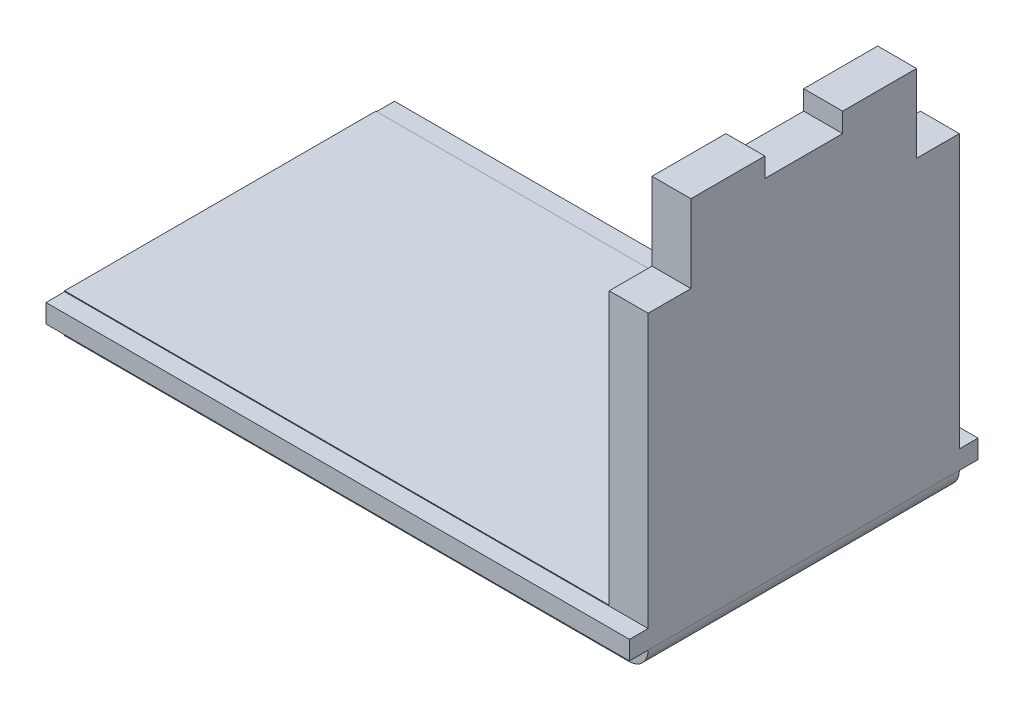
ISO-10303-21;
HEADER;
FILE_DESCRIPTION(('STEP AP214'),'2;1');
FILE_NAME('part.step','',(''),(''),'','','');
FILE_SCHEMA(('AUTOMOTIVE_DESIGN { 1 0 10303 214 1 1 1 1 }'));
ENDSEC;
DATA;
#1=APPLICATION_CONTEXT('core data for automotive mechanical design processes');
#2=APPLICATION_PROTOCOL_DEFINITION('international standard','automotive_design',2000,#1);
#3=PRODUCT_CONTEXT('',#1,'mechanical');
#4=PRODUCT('Part','Part','',(#3));
#5=PRODUCT_RELATED_PRODUCT_CATEGORY('part','',(#4));
#6=PRODUCT_DEFINITION_FORMATION('','',#4);
#7=PRODUCT_DEFINITION_CONTEXT('part definition',#1,'design');
#8=PRODUCT_DEFINITION('design','',#6,#7);
#9=PRODUCT_DEFINITION_SHAPE('','',#8);
#10=(LENGTH_UNIT() NAMED_UNIT(*) SI_UNIT(.MILLI.,.METRE.));
#11=(NAMED_UNIT(*) PLANE_ANGLE_UNIT() SI_UNIT($,.RADIAN.));
#12=(NAMED_UNIT(*) SI_UNIT($,.STERADIAN.) SOLID_ANGLE_UNIT());
#13=UNCERTAINTY_MEASURE_WITH_UNIT(LENGTH_MEASURE(1.E-05),#10,'distance_accuracy_value','');
#14=(GEOMETRIC_REPRESENTATION_CONTEXT(3) GLOBAL_UNCERTAINTY_ASSIGNED_CONTEXT((#13)) GLOBAL_UNIT_ASSIGNED_CONTEXT((#10,
#11,#12)) REPRESENTATION_CONTEXT('',''));
#15=CARTESIAN_POINT('',(0.,0.,0.));
#16=DIRECTION('',(0.,0.,1.));
#17=DIRECTION('',(1.,0.,0.));
#18=AXIS2_PLACEMENT_3D('',#15,#16,#17);
#19=CARTESIAN_POINT('',(70.,100.,80.));
#20=DIRECTION('',(0.,-1.,0.));
#21=DIRECTION('',(0.,0.,-1.));
#22=AXIS2_PLACEMENT_3D('',#19,#20,#21);
#23=PLANE('',#22);
#24=DIRECTION('',(0.,0.,-1.));
#25=VECTOR('',#24,1.);
#26=CARTESIAN_POINT('',(70.,100.,80.));
#27=LINE('',#26,#25);
#28=CARTESIAN_POINT('',(70.,100.,30.));
#29=VERTEX_POINT('',#28);
#30=CARTESIAN_POINT('',(70.,100.,11.));
#31=VERTEX_POINT('',#30);
#32=EDGE_CURVE('E226',#29,#31,#27,.T.);
#33=ORIENTED_EDGE('',*,*,#32,.T.);
#34=DIRECTION('',(1.,0.,0.));
#35=VECTOR('',#34,1.);
#36=CARTESIAN_POINT('',(-80.,100.,11.));
#37=LINE('',#36,#35);
#38=CARTESIAN_POINT('',(60.,100.,11.));
#39=VERTEX_POINT('',#38);
#40=EDGE_CURVE('E400',#39,#31,#37,.T.);
#41=ORIENTED_EDGE('',*,*,#40,.F.);
#42=DIRECTION('',(0.,0.,-1.));
#43=VECTOR('',#42,1.);
#44=CARTESIAN_POINT('',(60.,100.,80.));
#45=LINE('',#44,#43);
#46=CARTESIAN_POINT('',(60.,100.,30.));
#47=VERTEX_POINT('',#46);
#48=EDGE_CURVE('E235',#47,#39,#45,.T.);
#49=ORIENTED_EDGE('',*,*,#48,.F.);
#50=DIRECTION('',(1.,0.,0.));
#51=VECTOR('',#50,1.);
#52=CARTESIAN_POINT('',(-80.,100.,30.));
#53=LINE('',#52,#51);
#54=EDGE_CURVE('E422',#47,#29,#53,.T.);
#55=ORIENTED_EDGE('',*,*,#54,.T.);
#56=EDGE_LOOP('',(#33,#41,#49,#55));
#57=FACE_BOUND('',#56,.T.);
#58=ADVANCED_FACE('F44',(#57),#23,.F.);
#59=CARTESIAN_POINT('',(0.,0.,0.));
#60=DIRECTION('',(0.,0.,-1.));
#61=DIRECTION('',(-1.,0.,0.));
#62=AXIS2_PLACEMENT_3D('',#59,#60,#61);
#63=PLANE('',#62);
#64=DIRECTION('',(1.,0.,0.));
#65=VECTOR('',#64,1.);
#66=CARTESIAN_POINT('',(-86.7882250993909,5.,0.));
#67=LINE('',#66,#65);
#68=CARTESIAN_POINT('',(-80.,5.,0.));
#69=VERTEX_POINT('',#68);
#70=CARTESIAN_POINT('',(70.,5.,0.));
#71=VERTEX_POINT('',#70);
#72=EDGE_CURVE('E280',#69,#71,#67,.T.);
#73=ORIENTED_EDGE('',*,*,#72,.T.);
#74=CARTESIAN_POINT('',(65.,5.,0.));
#75=DIRECTION('',(0.,0.,-1.));
#76=DIRECTION('',(-1.,0.,0.));
#77=AXIS2_PLACEMENT_3D('',#74,#75,#76);
#78=CIRCLE('',#77,5.);
#79=CARTESIAN_POINT('',(65.,0.,0.));
#80=VERTEX_POINT('',#79);
#81=EDGE_CURVE('E67',#71,#80,#78,.T.);
#82=ORIENTED_EDGE('',*,*,#81,.T.);
#83=DIRECTION('',(1.,0.,0.));
#84=VECTOR('',#83,1.);
#85=CARTESIAN_POINT('',(-80.,0.,0.));
#86=LINE('',#85,#84);
#87=CARTESIAN_POINT('',(-80.,0.,0.));
#88=VERTEX_POINT('',#87);
#89=EDGE_CURVE('E362',#88,#80,#86,.T.);
#90=ORIENTED_EDGE('',*,*,#89,.F.);
#91=DIRECTION('',(0.,-1.,0.));
#92=VECTOR('',#91,1.);
#93=CARTESIAN_POINT('',(-80.,0.,0.));
#94=LINE('',#93,#92);
#95=EDGE_CURVE('E282',#69,#88,#94,.T.);
#96=ORIENTED_EDGE('',*,*,#95,.F.);
#97=EDGE_LOOP('',(#73,#82,#90,#96));
#98=FACE_BOUND('',#97,.T.);
#99=ADVANCED_FACE('F281',(#98),#63,.T.);
#100=CARTESIAN_POINT('',(0.,0.,80.));
#101=DIRECTION('',(0.,0.,-1.));
#102=DIRECTION('',(-1.,0.,0.));
#103=AXIS2_PLACEMENT_3D('',#100,#101,#102);
#104=PLANE('',#103);
#105=DIRECTION('',(1.,0.,0.));
#106=VECTOR('',#105,1.);
#107=CARTESIAN_POINT('',(-80.,0.,80.));
#108=LINE('',#107,#106);
#109=CARTESIAN_POINT('',(-80.,0.,80.));
#110=VERTEX_POINT('',#109);
#111=CARTESIAN_POINT('',(65.,0.,80.));
#112=VERTEX_POINT('',#111);
#113=EDGE_CURVE('E343',#110,#112,#108,.T.);
#114=ORIENTED_EDGE('',*,*,#113,.T.);
#115=CARTESIAN_POINT('',(65.,5.,80.));
#116=DIRECTION('',(0.,0.,-1.));
#117=DIRECTION('',(-1.,0.,0.));
#118=AXIS2_PLACEMENT_3D('',#115,#116,#117);
#119=CIRCLE('',#118,5.);
#120=CARTESIAN_POINT('',(70.,5.,80.));
#121=VERTEX_POINT('',#120);
#122=EDGE_CURVE('E11',#112,#121,#119,.F.);
#123=ORIENTED_EDGE('',*,*,#122,.T.);
#124=DIRECTION('',(1.,0.,0.));
#125=VECTOR('',#124,1.);
#126=CARTESIAN_POINT('',(-86.7882250993909,5.,80.));
#127=LINE('',#126,#125);
#128=CARTESIAN_POINT('',(-80.,5.,80.));
#129=VERTEX_POINT('',#128);
#130=EDGE_CURVE('E328',#129,#121,#127,.T.);
#131=ORIENTED_EDGE('',*,*,#130,.F.);
#132=DIRECTION('',(0.,-1.,0.));
#133=VECTOR('',#132,1.);
#134=CARTESIAN_POINT('',(-80.,0.,80.));
#135=LINE('',#134,#133);
#136=EDGE_CURVE('E344',#129,#110,#135,.T.);
#137=ORIENTED_EDGE('',*,*,#136,.T.);
#138=EDGE_LOOP('',(#114,#123,#131,#137));
#139=FACE_BOUND('',#138,.T.);
#140=ADVANCED_FACE('F501',(#139),#104,.F.);
#141=CARTESIAN_POINT('',(-80.,0.,80.));
#142=DIRECTION('',(1.,0.,0.));
#143=DIRECTION('',(0.,0.,-1.));
#144=AXIS2_PLACEMENT_3D('',#141,#142,#143);
#145=PLANE('',#144);
#146=CARTESIAN_POINT('',(-80.,10.,0.));
#147=VERTEX_POINT('',#146);
#148=CARTESIAN_POINT('',(-80.,9.8,0.));
#149=VERTEX_POINT('',#148);
#150=EDGE_CURVE('E358',#147,#149,#94,.T.);
#151=ORIENTED_EDGE('',*,*,#150,.T.);
#152=DIRECTION('',(0.,0.,-1.));
#153=VECTOR('',#152,1.);
#154=CARTESIAN_POINT('',(-80.,9.8,-4.8));
#155=LINE('',#154,#153);
#156=CARTESIAN_POINT('',(-80.,9.8,-4.8));
#157=VERTEX_POINT('',#156);
#158=EDGE_CURVE('E288',#149,#157,#155,.T.);
#159=ORIENTED_EDGE('',*,*,#158,.T.);
#160=DIRECTION('',(0.,-1.,0.));
#161=VECTOR('',#160,1.);
#162=CARTESIAN_POINT('',(-80.,5.,-4.8));
#163=LINE('',#162,#161);
#164=CARTESIAN_POINT('',(-80.,5.,-4.8));
#165=VERTEX_POINT('',#164);
#166=EDGE_CURVE('E308',#157,#165,#163,.T.);
#167=ORIENTED_EDGE('',*,*,#166,.T.);
#168=DIRECTION('',(0.,0.,1.));
#169=VECTOR('',#168,1.);
#170=CARTESIAN_POINT('',(-80.,5.,0.));
#171=LINE('',#170,#169);
#172=EDGE_CURVE('E305',#165,#69,#171,.T.);
#173=ORIENTED_EDGE('',*,*,#172,.T.);
#174=ORIENTED_EDGE('',*,*,#95,.T.);
#175=DIRECTION('',(0.,0.,-1.));
#176=VECTOR('',#175,1.);
#177=CARTESIAN_POINT('',(-80.,0.,80.));
#178=LINE('',#177,#176);
#179=EDGE_CURVE('E225',#110,#88,#178,.T.);
#180=ORIENTED_EDGE('',*,*,#179,.F.);
#181=ORIENTED_EDGE('',*,*,#136,.F.);
#182=DIRECTION('',(0.,0.,1.));
#183=VECTOR('',#182,1.);
#184=CARTESIAN_POINT('',(-80.,5.,80.));
#185=LINE('',#184,#183);
#186=CARTESIAN_POINT('',(-80.,5.,84.8));
#187=VERTEX_POINT('',#186);
#188=EDGE_CURVE('E319',#129,#187,#185,.T.);
#189=ORIENTED_EDGE('',*,*,#188,.T.);
#190=DIRECTION('',(0.,1.,0.));
#191=VECTOR('',#190,1.);
#192=CARTESIAN_POINT('',(-80.,5.,84.8));
#193=LINE('',#192,#191);
#194=CARTESIAN_POINT('',(-80.,9.8,84.8));
#195=VERTEX_POINT('',#194);
#196=EDGE_CURVE('E315',#187,#195,#193,.T.);
#197=ORIENTED_EDGE('',*,*,#196,.T.);
#198=DIRECTION('',(0.,0.,-1.));
#199=VECTOR('',#198,1.);
#200=CARTESIAN_POINT('',(-80.,9.8,84.8));
#201=LINE('',#200,#199);
#202=CARTESIAN_POINT('',(-80.,9.8,80.));
#203=VERTEX_POINT('',#202);
#204=EDGE_CURVE('E311',#195,#203,#201,.T.);
#205=ORIENTED_EDGE('',*,*,#204,.T.);
#206=CARTESIAN_POINT('',(-80.,10.,80.));
#207=VERTEX_POINT('',#206);
#208=EDGE_CURVE('E340',#207,#203,#135,.T.);
#209=ORIENTED_EDGE('',*,*,#208,.F.);
#210=DIRECTION('',(0.,0.,-1.));
#211=VECTOR('',#210,1.);
#212=CARTESIAN_POINT('',(-80.,10.,80.));
#213=LINE('',#212,#211);
#214=EDGE_CURVE('E357',#207,#147,#213,.T.);
#215=ORIENTED_EDGE('',*,*,#214,.T.);
#216=EDGE_LOOP('',(#151,#159,#167,#173,#174,#180,#181,#189,#197,#205,#209,#215));
#217=FACE_BOUND('',#216,.T.);
#218=ADVANCED_FACE('F463',(#217),#145,.F.);
#219=CARTESIAN_POINT('',(-80.,0.,80.));
#220=DIRECTION('',(0.,1.,0.));
#221=DIRECTION('',(0.,0.,1.));
#222=AXIS2_PLACEMENT_3D('',#219,#220,#221);
#223=PLANE('',#222);
#224=ORIENTED_EDGE('',*,*,#89,.T.);
#225=DIRECTION('',(0.,0.,-1.));
#226=VECTOR('',#225,1.);
#227=CARTESIAN_POINT('',(65.,0.,80.));
#228=LINE('',#227,#226);
#229=EDGE_CURVE('E53',#80,#112,#228,.F.);
#230=ORIENTED_EDGE('',*,*,#229,.T.);
#231=ORIENTED_EDGE('',*,*,#113,.F.);
#232=ORIENTED_EDGE('',*,*,#179,.T.);
#233=EDGE_LOOP('',(#224,#230,#231,#232));
#234=FACE_BOUND('',#233,.T.);
#235=ADVANCED_FACE('F509',(#234),#223,.F.);
#236=CARTESIAN_POINT('',(70.,0.,80.));
#237=DIRECTION('',(-1.,0.,0.));
#238=DIRECTION('',(0.,0.,1.));
#239=AXIS2_PLACEMENT_3D('',#236,#237,#238);
#240=PLANE('',#239);
#241=DIRECTION('',(0.,0.,-1.));
#242=VECTOR('',#241,1.);
#243=CARTESIAN_POINT('',(70.,5.,80.));
#244=LINE('',#243,#242);
#245=CARTESIAN_POINT('',(70.,5.,84.8));
#246=VERTEX_POINT('',#245);
#247=EDGE_CURVE('E276',#246,#121,#244,.T.);
#248=ORIENTED_EDGE('',*,*,#247,.T.);
#249=DIRECTION('',(0.,0.,-1.));
#250=VECTOR('',#249,1.);
#251=CARTESIAN_POINT('',(70.,5.,80.));
#252=LINE('',#251,#250);
#253=EDGE_CURVE('E263',#121,#71,#252,.T.);
#254=ORIENTED_EDGE('',*,*,#253,.T.);
#255=DIRECTION('',(0.,0.,-1.));
#256=VECTOR('',#255,1.);
#257=CARTESIAN_POINT('',(70.,5.,0.));
#258=LINE('',#257,#256);
#259=CARTESIAN_POINT('',(70.,5.,-4.8));
#260=VERTEX_POINT('',#259);
#261=EDGE_CURVE('E273',#71,#260,#258,.T.);
#262=ORIENTED_EDGE('',*,*,#261,.T.);
#263=DIRECTION('',(0.,1.,0.));
#264=VECTOR('',#263,1.);
#265=CARTESIAN_POINT('',(70.,5.,-4.8));
#266=LINE('',#265,#264);
#267=CARTESIAN_POINT('',(70.,9.8,-4.8));
#268=VERTEX_POINT('',#267);
#269=EDGE_CURVE('E295',#260,#268,#266,.T.);
#270=ORIENTED_EDGE('',*,*,#269,.T.);
#271=DIRECTION('',(0.,0.,1.));
#272=VECTOR('',#271,1.);
#273=CARTESIAN_POINT('',(70.,9.8,-4.8));
#274=LINE('',#273,#272);
#275=CARTESIAN_POINT('',(70.,9.8,0.));
#276=VERTEX_POINT('',#275);
#277=EDGE_CURVE('E301',#268,#276,#274,.T.);
#278=ORIENTED_EDGE('',*,*,#277,.T.);
#279=DIRECTION('',(0.,1.,0.));
#280=VECTOR('',#279,1.);
#281=CARTESIAN_POINT('',(70.,0.,0.));
#282=LINE('',#281,#280);
#283=CARTESIAN_POINT('',(70.,80.,0.));
#284=VERTEX_POINT('',#283);
#285=EDGE_CURVE('E365',#276,#284,#282,.T.);
#286=ORIENTED_EDGE('',*,*,#285,.T.);
#287=DIRECTION('',(0.,0.,-1.));
#288=VECTOR('',#287,1.);
#289=CARTESIAN_POINT('',(70.,80.,0.));
#290=LINE('',#289,#288);
#291=CARTESIAN_POINT('',(70.,80.,11.));
#292=VERTEX_POINT('',#291);
#293=EDGE_CURVE('E403',#292,#284,#290,.T.);
#294=ORIENTED_EDGE('',*,*,#293,.F.);
#295=DIRECTION('',(0.,-1.,0.));
#296=VECTOR('',#295,1.);
#297=CARTESIAN_POINT('',(70.,80.,11.));
#298=LINE('',#297,#296);
#299=EDGE_CURVE('E216',#31,#292,#298,.T.);
#300=ORIENTED_EDGE('',*,*,#299,.F.);
#301=ORIENTED_EDGE('',*,*,#32,.F.);
#302=DIRECTION('',(0.,1.,0.));
#303=VECTOR('',#302,1.);
#304=CARTESIAN_POINT('',(70.,95.,30.));
#305=LINE('',#304,#303);
#306=CARTESIAN_POINT('',(70.,95.,30.));
#307=VERTEX_POINT('',#306);
#308=EDGE_CURVE('E418',#307,#29,#305,.T.);
#309=ORIENTED_EDGE('',*,*,#308,.F.);
#310=DIRECTION('',(0.,0.,-1.));
#311=VECTOR('',#310,1.);
#312=CARTESIAN_POINT('',(70.,95.,50.));
#313=LINE('',#312,#311);
#314=CARTESIAN_POINT('',(70.,95.,50.));
#315=VERTEX_POINT('',#314);
#316=EDGE_CURVE('E414',#315,#307,#313,.T.);
#317=ORIENTED_EDGE('',*,*,#316,.F.);
#318=DIRECTION('',(0.,-1.,0.));
#319=VECTOR('',#318,1.);
#320=CARTESIAN_POINT('',(70.,100.,50.));
#321=LINE('',#320,#319);
#322=CARTESIAN_POINT('',(70.,100.,50.));
#323=VERTEX_POINT('',#322);
#324=EDGE_CURVE('E223',#323,#315,#321,.T.);
#325=ORIENTED_EDGE('',*,*,#324,.F.);
#326=CARTESIAN_POINT('',(70.,100.,69.));
#327=VERTEX_POINT('',#326);
#328=EDGE_CURVE('E212',#327,#323,#27,.T.);
#329=ORIENTED_EDGE('',*,*,#328,.F.);
#330=DIRECTION('',(0.,1.,0.));
#331=VECTOR('',#330,1.);
#332=CARTESIAN_POINT('',(70.,80.,69.));
#333=LINE('',#332,#331);
#334=CARTESIAN_POINT('',(70.,80.,69.));
#335=VERTEX_POINT('',#334);
#336=EDGE_CURVE('E193',#335,#327,#333,.T.);
#337=ORIENTED_EDGE('',*,*,#336,.F.);
#338=DIRECTION('',(0.,0.,-1.));
#339=VECTOR('',#338,1.);
#340=CARTESIAN_POINT('',(70.,80.,80.));
#341=LINE('',#340,#339);
#342=CARTESIAN_POINT('',(70.,80.,80.));
#343=VERTEX_POINT('',#342);
#344=EDGE_CURVE('E205',#343,#335,#341,.T.);
#345=ORIENTED_EDGE('',*,*,#344,.F.);
#346=DIRECTION('',(0.,1.,0.));
#347=VECTOR('',#346,1.);
#348=CARTESIAN_POINT('',(70.,0.,80.));
#349=LINE('',#348,#347);
#350=CARTESIAN_POINT('',(70.,9.8,80.));
#351=VERTEX_POINT('',#350);
#352=EDGE_CURVE('E347',#351,#343,#349,.T.);
#353=ORIENTED_EDGE('',*,*,#352,.F.);
#354=DIRECTION('',(0.,0.,1.));
#355=VECTOR('',#354,1.);
#356=CARTESIAN_POINT('',(70.,9.8,84.8));
#357=LINE('',#356,#355);
#358=CARTESIAN_POINT('',(70.,9.8,84.8));
#359=VERTEX_POINT('',#358);
#360=EDGE_CURVE('E299',#351,#359,#357,.T.);
#361=ORIENTED_EDGE('',*,*,#360,.T.);
#362=DIRECTION('',(0.,-1.,0.));
#363=VECTOR('',#362,1.);
#364=CARTESIAN_POINT('',(70.,5.,84.8));
#365=LINE('',#364,#363);
#366=EDGE_CURVE('E325',#359,#246,#365,.T.);
#367=ORIENTED_EDGE('',*,*,#366,.T.);
#368=EDGE_LOOP('',(#248,#254,#262,#270,#278,#286,#294,#300,#301,#309,#317,#325,#329,#337,#345,
#353,#361,#367));
#369=FACE_BOUND('',#368,.T.);
#370=ADVANCED_FACE('F220',(#369),#240,.F.);
#371=CARTESIAN_POINT('',(60.,100.,69.));
#372=VERTEX_POINT('',#371);
#373=CARTESIAN_POINT('',(60.,100.,50.));
#374=VERTEX_POINT('',#373);
#375=EDGE_CURVE('E214',#372,#374,#45,.T.);
#376=ORIENTED_EDGE('',*,*,#375,.F.);
#377=DIRECTION('',(1.,0.,0.));
#378=VECTOR('',#377,1.);
#379=CARTESIAN_POINT('',(-80.,100.,69.));
#380=LINE('',#379,#378);
#381=EDGE_CURVE('E196',#372,#327,#380,.T.);
#382=ORIENTED_EDGE('',*,*,#381,.T.);
#383=ORIENTED_EDGE('',*,*,#328,.T.);
#384=DIRECTION('',(1.,0.,0.));
#385=VECTOR('',#384,1.);
#386=CARTESIAN_POINT('',(-80.,100.,50.));
#387=LINE('',#386,#385);
#388=EDGE_CURVE('E421',#374,#323,#387,.T.);
#389=ORIENTED_EDGE('',*,*,#388,.F.);
#390=EDGE_LOOP('',(#376,#382,#383,#389));
#391=FACE_BOUND('',#390,.T.);
#392=ADVANCED_FACE('F210',(#391),#23,.F.);
#393=CARTESIAN_POINT('',(60.,10.,80.));
#394=DIRECTION('',(1.,0.,0.));
#395=DIRECTION('',(0.,0.,-1.));
#396=AXIS2_PLACEMENT_3D('',#393,#394,#395);
#397=PLANE('',#396);
#398=DIRECTION('',(0.,-1.,0.));
#399=VECTOR('',#398,1.);
#400=CARTESIAN_POINT('',(60.,10.,11.));
#401=LINE('',#400,#399);
#402=CARTESIAN_POINT('',(60.,80.,11.));
#403=VERTEX_POINT('',#402);
#404=EDGE_CURVE('E259',#39,#403,#401,.T.);
#405=ORIENTED_EDGE('',*,*,#404,.T.);
#406=DIRECTION('',(0.,0.,-1.));
#407=VECTOR('',#406,1.);
#408=CARTESIAN_POINT('',(60.,80.0000000000001,79.9999999999999));
#409=LINE('',#408,#407);
#410=CARTESIAN_POINT('',(60.,80.,0.));
#411=VERTEX_POINT('',#410);
#412=EDGE_CURVE('E426',#403,#411,#409,.T.);
#413=ORIENTED_EDGE('',*,*,#412,.T.);
#414=DIRECTION('',(0.,-1.,0.));
#415=VECTOR('',#414,1.);
#416=CARTESIAN_POINT('',(60.,10.,0.));
#417=LINE('',#416,#415);
#418=CARTESIAN_POINT('',(60.,10.,0.));
#419=VERTEX_POINT('',#418);
#420=EDGE_CURVE('E369',#411,#419,#417,.T.);
#421=ORIENTED_EDGE('',*,*,#420,.T.);
#422=DIRECTION('',(0.,0.,-1.));
#423=VECTOR('',#422,1.);
#424=CARTESIAN_POINT('',(60.,10.,80.));
#425=LINE('',#424,#423);
#426=CARTESIAN_POINT('',(60.,10.,80.));
#427=VERTEX_POINT('',#426);
#428=EDGE_CURVE('E377',#427,#419,#425,.T.);
#429=ORIENTED_EDGE('',*,*,#428,.F.);
#430=DIRECTION('',(0.,-1.,0.));
#431=VECTOR('',#430,1.);
#432=CARTESIAN_POINT('',(60.,10.,80.));
#433=LINE('',#432,#431);
#434=CARTESIAN_POINT('',(60.,80.,80.));
#435=VERTEX_POINT('',#434);
#436=EDGE_CURVE('E351',#435,#427,#433,.T.);
#437=ORIENTED_EDGE('',*,*,#436,.F.);
#438=DIRECTION('',(0.,0.,-1.));
#439=VECTOR('',#438,1.);
#440=CARTESIAN_POINT('',(60.,80.,80.));
#441=LINE('',#440,#439);
#442=CARTESIAN_POINT('',(60.,80.,69.));
#443=VERTEX_POINT('',#442);
#444=EDGE_CURVE('E392',#435,#443,#441,.T.);
#445=ORIENTED_EDGE('',*,*,#444,.T.);
#446=DIRECTION('',(0.,1.,0.));
#447=VECTOR('',#446,1.);
#448=CARTESIAN_POINT('',(60.,10.,69.));
#449=LINE('',#448,#447);
#450=EDGE_CURVE('E256',#443,#372,#449,.T.);
#451=ORIENTED_EDGE('',*,*,#450,.T.);
#452=ORIENTED_EDGE('',*,*,#375,.T.);
#453=DIRECTION('',(0.,-1.,0.));
#454=VECTOR('',#453,1.);
#455=CARTESIAN_POINT('',(60.,10.,49.9999999999999));
#456=LINE('',#455,#454);
#457=CARTESIAN_POINT('',(60.,95.,50.));
#458=VERTEX_POINT('',#457);
#459=EDGE_CURVE('E244',#374,#458,#456,.T.);
#460=ORIENTED_EDGE('',*,*,#459,.T.);
#461=DIRECTION('',(0.,0.,-1.));
#462=VECTOR('',#461,1.);
#463=CARTESIAN_POINT('',(60.,95.,80.));
#464=LINE('',#463,#462);
#465=CARTESIAN_POINT('',(60.,95.,30.));
#466=VERTEX_POINT('',#465);
#467=EDGE_CURVE('E248',#458,#466,#464,.T.);
#468=ORIENTED_EDGE('',*,*,#467,.T.);
#469=DIRECTION('',(0.,1.,0.));
#470=VECTOR('',#469,1.);
#471=CARTESIAN_POINT('',(60.,10.,30.));
#472=LINE('',#471,#470);
#473=EDGE_CURVE('E252',#466,#47,#472,.T.);
#474=ORIENTED_EDGE('',*,*,#473,.T.);
#475=ORIENTED_EDGE('',*,*,#48,.T.);
#476=EDGE_LOOP('',(#405,#413,#421,#429,#437,#445,#451,#452,#460,#468,#474,#475));
#477=FACE_BOUND('',#476,.T.);
#478=ADVANCED_FACE('F389',(#477),#397,.F.);
#479=CARTESIAN_POINT('',(-80.,10.,80.));
#480=DIRECTION('',(0.,-1.,0.));
#481=DIRECTION('',(0.,0.,-1.));
#482=AXIS2_PLACEMENT_3D('',#479,#480,#481);
#483=PLANE('',#482);
#484=DIRECTION('',(-1.,0.,0.));
#485=VECTOR('',#484,1.);
#486=CARTESIAN_POINT('',(-80.,10.,0.));
#487=LINE('',#486,#485);
#488=EDGE_CURVE('E372',#419,#147,#487,.T.);
#489=ORIENTED_EDGE('',*,*,#488,.T.);
#490=ORIENTED_EDGE('',*,*,#214,.F.);
#491=DIRECTION('',(-1.,0.,0.));
#492=VECTOR('',#491,1.);
#493=CARTESIAN_POINT('',(-80.,10.,80.));
#494=LINE('',#493,#492);
#495=EDGE_CURVE('E354',#427,#207,#494,.T.);
#496=ORIENTED_EDGE('',*,*,#495,.F.);
#497=ORIENTED_EDGE('',*,*,#428,.T.);
#498=EDGE_LOOP('',(#489,#490,#496,#497));
#499=FACE_BOUND('',#498,.T.);
#500=ADVANCED_FACE('F466',(#499),#483,.F.);
#501=ORIENTED_EDGE('',*,*,#352,.T.);
#502=DIRECTION('',(-1.,0.,0.));
#503=VECTOR('',#502,1.);
#504=CARTESIAN_POINT('',(0.,80.,80.));
#505=LINE('',#504,#503);
#506=EDGE_CURVE('E240',#343,#435,#505,.T.);
#507=ORIENTED_EDGE('',*,*,#506,.T.);
#508=ORIENTED_EDGE('',*,*,#436,.T.);
#509=ORIENTED_EDGE('',*,*,#495,.T.);
#510=ORIENTED_EDGE('',*,*,#208,.T.);
#511=DIRECTION('',(1.,0.,0.));
#512=VECTOR('',#511,1.);
#513=CARTESIAN_POINT('',(-86.7882250993909,9.8,80.));
#514=LINE('',#513,#512);
#515=EDGE_CURVE('E334',#203,#351,#514,.T.);
#516=ORIENTED_EDGE('',*,*,#515,.T.);
#517=EDGE_LOOP('',(#501,#507,#508,#509,#510,#516));
#518=FACE_BOUND('',#517,.T.);
#519=ADVANCED_FACE('F523',(#518),#104,.F.);
#520=DIRECTION('',(-1.,0.,0.));
#521=VECTOR('',#520,1.);
#522=CARTESIAN_POINT('',(0.,80.,0.));
#523=LINE('',#522,#521);
#524=EDGE_CURVE('E231',#284,#411,#523,.T.);
#525=ORIENTED_EDGE('',*,*,#524,.F.);
#526=ORIENTED_EDGE('',*,*,#285,.F.);
#527=DIRECTION('',(1.,0.,0.));
#528=VECTOR('',#527,1.);
#529=CARTESIAN_POINT('',(-86.7882250993909,9.8,0.));
#530=LINE('',#529,#528);
#531=EDGE_CURVE('E287',#149,#276,#530,.T.);
#532=ORIENTED_EDGE('',*,*,#531,.F.);
#533=ORIENTED_EDGE('',*,*,#150,.F.);
#534=ORIENTED_EDGE('',*,*,#488,.F.);
#535=ORIENTED_EDGE('',*,*,#420,.F.);
#536=EDGE_LOOP('',(#525,#526,#532,#533,#534,#535));
#537=FACE_BOUND('',#536,.T.);
#538=ADVANCED_FACE('F461',(#537),#63,.T.);
#539=CARTESIAN_POINT('',(-86.7882250993909,5.,80.));
#540=DIRECTION('',(0.,-1.,0.));
#541=DIRECTION('',(0.,0.,-1.));
#542=AXIS2_PLACEMENT_3D('',#539,#540,#541);
#543=PLANE('',#542);
#544=ORIENTED_EDGE('',*,*,#188,.F.);
#545=ORIENTED_EDGE('',*,*,#130,.T.);
#546=ORIENTED_EDGE('',*,*,#247,.F.);
#547=DIRECTION('',(1.,0.,0.));
#548=VECTOR('',#547,1.);
#549=CARTESIAN_POINT('',(-86.7882250993909,5.,84.8));
#550=LINE('',#549,#548);
#551=EDGE_CURVE('E316',#187,#246,#550,.T.);
#552=ORIENTED_EDGE('',*,*,#551,.F.);
#553=EDGE_LOOP('',(#544,#545,#546,#552));
#554=FACE_BOUND('',#553,.T.);
#555=ADVANCED_FACE('F532',(#554),#543,.T.);
#556=CARTESIAN_POINT('',(-86.7882250993909,5.,84.8));
#557=DIRECTION('',(0.,0.,1.));
#558=DIRECTION('',(1.,0.,0.));
#559=AXIS2_PLACEMENT_3D('',#556,#557,#558);
#560=PLANE('',#559);
#561=ORIENTED_EDGE('',*,*,#196,.F.);
#562=ORIENTED_EDGE('',*,*,#551,.T.);
#563=ORIENTED_EDGE('',*,*,#366,.F.);
#564=DIRECTION('',(1.,0.,0.));
#565=VECTOR('',#564,1.);
#566=CARTESIAN_POINT('',(-86.7882250993909,9.8,84.8));
#567=LINE('',#566,#565);
#568=EDGE_CURVE('E331',#195,#359,#567,.T.);
#569=ORIENTED_EDGE('',*,*,#568,.F.);
#570=EDGE_LOOP('',(#561,#562,#563,#569));
#571=FACE_BOUND('',#570,.T.);
#572=ADVANCED_FACE('F544',(#571),#560,.T.);
#573=CARTESIAN_POINT('',(-86.7882250993909,9.8,84.8));
#574=DIRECTION('',(0.,1.,0.));
#575=DIRECTION('',(0.,0.,1.));
#576=AXIS2_PLACEMENT_3D('',#573,#574,#575);
#577=PLANE('',#576);
#578=ORIENTED_EDGE('',*,*,#204,.F.);
#579=ORIENTED_EDGE('',*,*,#568,.T.);
#580=ORIENTED_EDGE('',*,*,#360,.F.);
#581=ORIENTED_EDGE('',*,*,#515,.F.);
#582=EDGE_LOOP('',(#578,#579,#580,#581));
#583=FACE_BOUND('',#582,.T.);
#584=ADVANCED_FACE('F540',(#583),#577,.T.);
#585=CARTESIAN_POINT('',(-86.7882250993909,5.,0.));
#586=DIRECTION('',(0.,-1.,0.));
#587=DIRECTION('',(0.,0.,-1.));
#588=AXIS2_PLACEMENT_3D('',#585,#586,#587);
#589=PLANE('',#588);
#590=ORIENTED_EDGE('',*,*,#172,.F.);
#591=DIRECTION('',(1.,0.,0.));
#592=VECTOR('',#591,1.);
#593=CARTESIAN_POINT('',(-86.7882250993909,5.,-4.8));
#594=LINE('',#593,#592);
#595=EDGE_CURVE('E292',#165,#260,#594,.T.);
#596=ORIENTED_EDGE('',*,*,#595,.T.);
#597=ORIENTED_EDGE('',*,*,#261,.F.);
#598=ORIENTED_EDGE('',*,*,#72,.F.);
#599=EDGE_LOOP('',(#590,#596,#597,#598));
#600=FACE_BOUND('',#599,.T.);
#601=ADVANCED_FACE('F290',(#600),#589,.T.);
#602=CARTESIAN_POINT('',(-86.7882250993909,9.8,-4.8));
#603=DIRECTION('',(0.,1.,0.));
#604=DIRECTION('',(0.,0.,1.));
#605=AXIS2_PLACEMENT_3D('',#602,#603,#604);
#606=PLANE('',#605);
#607=ORIENTED_EDGE('',*,*,#158,.F.);
#608=ORIENTED_EDGE('',*,*,#531,.T.);
#609=ORIENTED_EDGE('',*,*,#277,.F.);
#610=DIRECTION('',(1.,0.,0.));
#611=VECTOR('',#610,1.);
#612=CARTESIAN_POINT('',(-86.7882250993909,9.8,-4.8));
#613=LINE('',#612,#611);
#614=EDGE_CURVE('E444',#157,#268,#613,.T.);
#615=ORIENTED_EDGE('',*,*,#614,.F.);
#616=EDGE_LOOP('',(#607,#608,#609,#615));
#617=FACE_BOUND('',#616,.T.);
#618=ADVANCED_FACE('F456',(#617),#606,.T.);
#619=CARTESIAN_POINT('',(-86.7882250993909,5.,-4.8));
#620=DIRECTION('',(0.,0.,-1.));
#621=DIRECTION('',(-1.,0.,0.));
#622=AXIS2_PLACEMENT_3D('',#619,#620,#621);
#623=PLANE('',#622);
#624=ORIENTED_EDGE('',*,*,#166,.F.);
#625=ORIENTED_EDGE('',*,*,#614,.T.);
#626=ORIENTED_EDGE('',*,*,#269,.F.);
#627=ORIENTED_EDGE('',*,*,#595,.F.);
#628=EDGE_LOOP('',(#624,#625,#626,#627));
#629=FACE_BOUND('',#628,.T.);
#630=ADVANCED_FACE('F553',(#629),#623,.T.);
#631=CARTESIAN_POINT('',(-80.,80.,11.));
#632=DIRECTION('',(0.,0.,1.));
#633=DIRECTION('',(0.,-1.,0.));
#634=AXIS2_PLACEMENT_3D('',#631,#632,#633);
#635=PLANE('',#634);
#636=ORIENTED_EDGE('',*,*,#40,.T.);
#637=ORIENTED_EDGE('',*,*,#299,.T.);
#638=DIRECTION('',(1.,0.,0.));
#639=VECTOR('',#638,1.);
#640=CARTESIAN_POINT('',(-80.,80.,11.));
#641=LINE('',#640,#639);
#642=EDGE_CURVE('E404',#403,#292,#641,.T.);
#643=ORIENTED_EDGE('',*,*,#642,.F.);
#644=ORIENTED_EDGE('',*,*,#404,.F.);
#645=EDGE_LOOP('',(#636,#637,#643,#644));
#646=FACE_BOUND('',#645,.T.);
#647=ADVANCED_FACE('F472',(#646),#635,.F.);
#648=CARTESIAN_POINT('',(-80.,80.,0.));
#649=DIRECTION('',(0.,-1.,0.));
#650=DIRECTION('',(0.,0.,-1.));
#651=AXIS2_PLACEMENT_3D('',#648,#649,#650);
#652=PLANE('',#651);
#653=ORIENTED_EDGE('',*,*,#642,.T.);
#654=ORIENTED_EDGE('',*,*,#293,.T.);
#655=ORIENTED_EDGE('',*,*,#524,.T.);
#656=ORIENTED_EDGE('',*,*,#412,.F.);
#657=EDGE_LOOP('',(#653,#654,#655,#656));
#658=FACE_BOUND('',#657,.T.);
#659=ADVANCED_FACE('F470',(#658),#652,.F.);
#660=CARTESIAN_POINT('',(-80.,80.,69.));
#661=DIRECTION('',(0.,0.,-1.));
#662=DIRECTION('',(-1.,0.,0.));
#663=AXIS2_PLACEMENT_3D('',#660,#661,#662);
#664=PLANE('',#663);
#665=DIRECTION('',(1.,0.,0.));
#666=VECTOR('',#665,1.);
#667=CARTESIAN_POINT('',(-80.,80.,69.));
#668=LINE('',#667,#666);
#669=EDGE_CURVE('E199',#443,#335,#668,.T.);
#670=ORIENTED_EDGE('',*,*,#669,.T.);
#671=ORIENTED_EDGE('',*,*,#336,.T.);
#672=ORIENTED_EDGE('',*,*,#381,.F.);
#673=ORIENTED_EDGE('',*,*,#450,.F.);
#674=EDGE_LOOP('',(#670,#671,#672,#673));
#675=FACE_BOUND('',#674,.T.);
#676=ADVANCED_FACE('F195',(#675),#664,.F.);
#677=CARTESIAN_POINT('',(-80.,80.,80.));
#678=DIRECTION('',(0.,-1.,0.));
#679=DIRECTION('',(0.,0.,-1.));
#680=AXIS2_PLACEMENT_3D('',#677,#678,#679);
#681=PLANE('',#680);
#682=ORIENTED_EDGE('',*,*,#506,.F.);
#683=ORIENTED_EDGE('',*,*,#344,.T.);
#684=ORIENTED_EDGE('',*,*,#669,.F.);
#685=ORIENTED_EDGE('',*,*,#444,.F.);
#686=EDGE_LOOP('',(#682,#683,#684,#685));
#687=FACE_BOUND('',#686,.T.);
#688=ADVANCED_FACE('F394',(#687),#681,.F.);
#689=CARTESIAN_POINT('',(-80.,95.,30.));
#690=DIRECTION('',(0.,0.,-1.));
#691=DIRECTION('',(-1.,0.,0.));
#692=AXIS2_PLACEMENT_3D('',#689,#690,#691);
#693=PLANE('',#692);
#694=DIRECTION('',(1.,0.,0.));
#695=VECTOR('',#694,1.);
#696=CARTESIAN_POINT('',(-80.,95.,30.));
#697=LINE('',#696,#695);
#698=EDGE_CURVE('E427',#466,#307,#697,.T.);
#699=ORIENTED_EDGE('',*,*,#698,.T.);
#700=ORIENTED_EDGE('',*,*,#308,.T.);
#701=ORIENTED_EDGE('',*,*,#54,.F.);
#702=ORIENTED_EDGE('',*,*,#473,.F.);
#703=EDGE_LOOP('',(#699,#700,#701,#702));
#704=FACE_BOUND('',#703,.T.);
#705=ADVANCED_FACE('F479',(#704),#693,.F.);
#706=CARTESIAN_POINT('',(-80.,95.,50.));
#707=DIRECTION('',(0.,-1.,0.));
#708=DIRECTION('',(0.,0.,-1.));
#709=AXIS2_PLACEMENT_3D('',#706,#707,#708);
#710=PLANE('',#709);
#711=DIRECTION('',(1.,0.,0.));
#712=VECTOR('',#711,1.);
#713=CARTESIAN_POINT('',(-80.,95.,50.));
#714=LINE('',#713,#712);
#715=EDGE_CURVE('E430',#458,#315,#714,.T.);
#716=ORIENTED_EDGE('',*,*,#715,.T.);
#717=ORIENTED_EDGE('',*,*,#316,.T.);
#718=ORIENTED_EDGE('',*,*,#698,.F.);
#719=ORIENTED_EDGE('',*,*,#467,.F.);
#720=EDGE_LOOP('',(#716,#717,#718,#719));
#721=FACE_BOUND('',#720,.T.);
#722=ADVANCED_FACE('F483',(#721),#710,.F.);
#723=CARTESIAN_POINT('',(-80.,100.,50.));
#724=DIRECTION('',(0.,0.,1.));
#725=DIRECTION('',(0.,-1.,0.));
#726=AXIS2_PLACEMENT_3D('',#723,#724,#725);
#727=PLANE('',#726);
#728=ORIENTED_EDGE('',*,*,#388,.T.);
#729=ORIENTED_EDGE('',*,*,#324,.T.);
#730=ORIENTED_EDGE('',*,*,#715,.F.);
#731=ORIENTED_EDGE('',*,*,#459,.F.);
#732=EDGE_LOOP('',(#728,#729,#730,#731));
#733=FACE_BOUND('',#732,.T.);
#734=ADVANCED_FACE('F485',(#733),#727,.F.);
#735=CARTESIAN_POINT('',(65.,5.,80.));
#736=DIRECTION('',(0.,0.,-1.));
#737=DIRECTION('',(-1.,0.,0.));
#738=AXIS2_PLACEMENT_3D('',#735,#736,#737);
#739=CYLINDRICAL_SURFACE('',#738,5.);
#740=ORIENTED_EDGE('',*,*,#122,.F.);
#741=ORIENTED_EDGE('',*,*,#229,.F.);
#742=ORIENTED_EDGE('',*,*,#81,.F.);
#743=ORIENTED_EDGE('',*,*,#253,.F.);
#744=EDGE_LOOP('',(#740,#741,#742,#743));
#745=FACE_BOUND('',#744,.T.);
#746=ADVANCED_FACE('F46',(#745),#739,.T.);
#747=CLOSED_SHELL('',(#58,#99,#140,#218,#235,#370,#392,#478,#500,#519,#538,#555,#572,#584,#601,
#618,#630,#647,#659,#676,#688,#705,#722,#734,#746));
#748=MANIFOLD_SOLID_BREP('B2',#747);
#749=ADVANCED_BREP_SHAPE_REPRESENTATION('',(#18,#748),#14);
#750=SHAPE_DEFINITION_REPRESENTATION(#9,#749);
ENDSEC;
END-ISO-10303-21;
